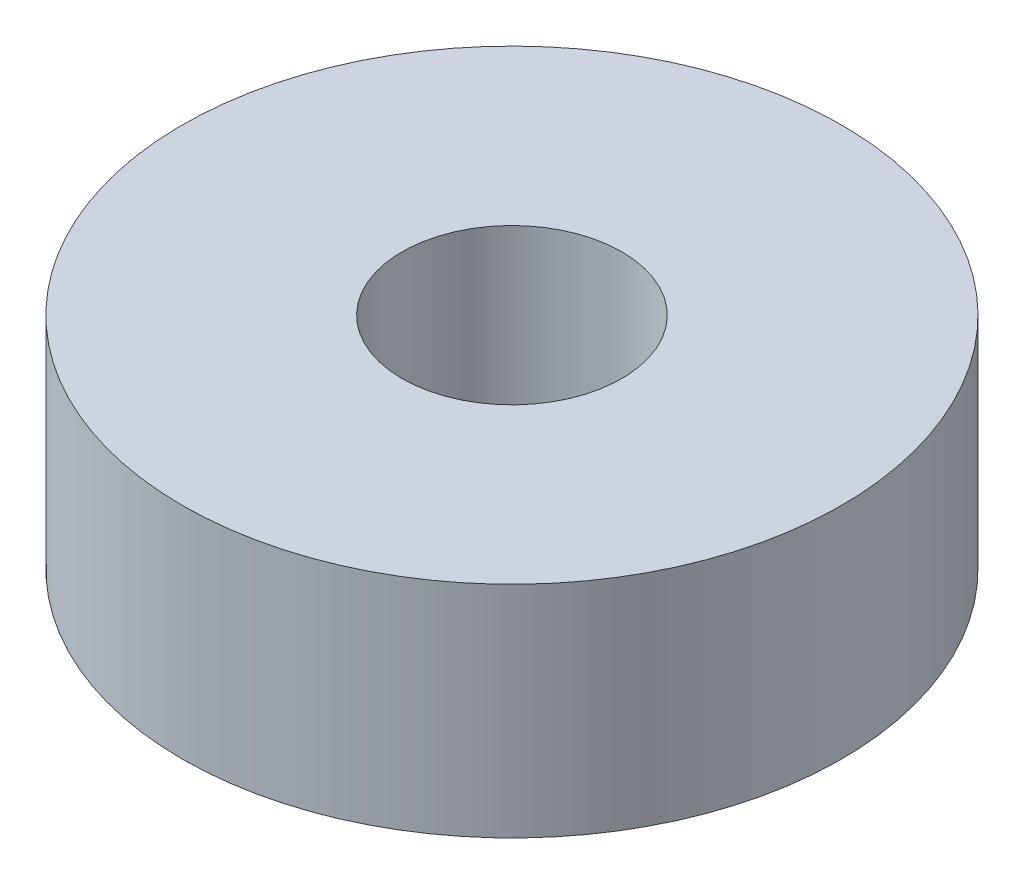
ISO-10303-21;
HEADER;
FILE_DESCRIPTION(('STEP AP214'),'2;1');
FILE_NAME('part.step','',(''),(''),'','','');
FILE_SCHEMA(('AUTOMOTIVE_DESIGN { 1 0 10303 214 1 1 1 1 }'));
ENDSEC;
DATA;
#1=APPLICATION_CONTEXT('core data for automotive mechanical design processes');
#2=APPLICATION_PROTOCOL_DEFINITION('international standard','automotive_design',2000,#1);
#3=PRODUCT_CONTEXT('',#1,'mechanical');
#4=PRODUCT('Part','Part','',(#3));
#5=PRODUCT_RELATED_PRODUCT_CATEGORY('part','',(#4));
#6=PRODUCT_DEFINITION_FORMATION('','',#4);
#7=PRODUCT_DEFINITION_CONTEXT('part definition',#1,'design');
#8=PRODUCT_DEFINITION('design','',#6,#7);
#9=PRODUCT_DEFINITION_SHAPE('','',#8);
#10=(LENGTH_UNIT() NAMED_UNIT(*) SI_UNIT(.MILLI.,.METRE.));
#11=(NAMED_UNIT(*) PLANE_ANGLE_UNIT() SI_UNIT($,.RADIAN.));
#12=(NAMED_UNIT(*) SI_UNIT($,.STERADIAN.) SOLID_ANGLE_UNIT());
#13=UNCERTAINTY_MEASURE_WITH_UNIT(LENGTH_MEASURE(1.E-05),#10,'distance_accuracy_value','');
#14=(GEOMETRIC_REPRESENTATION_CONTEXT(3) GLOBAL_UNCERTAINTY_ASSIGNED_CONTEXT((#13)) GLOBAL_UNIT_ASSIGNED_CONTEXT((#10,
#11,#12)) REPRESENTATION_CONTEXT('',''));
#15=CARTESIAN_POINT('',(0.,0.,0.));
#16=DIRECTION('',(0.,0.,1.));
#17=DIRECTION('',(1.,0.,0.));
#18=AXIS2_PLACEMENT_3D('',#15,#16,#17);
#19=CARTESIAN_POINT('',(0.,4.,0.));
#20=DIRECTION('',(0.,1.,0.));
#21=DIRECTION('',(0.,0.,1.));
#22=AXIS2_PLACEMENT_3D('',#19,#20,#21);
#23=PLANE('',#22);
#24=CARTESIAN_POINT('',(0.,4.,0.));
#25=DIRECTION('',(0.,1.,0.));
#26=DIRECTION('',(0.,0.,1.));
#27=AXIS2_PLACEMENT_3D('',#24,#25,#26);
#28=CIRCLE('',#27,6.);
#29=CARTESIAN_POINT('',(0.,4.,6.));
#30=VERTEX_POINT('',#29);
#31=EDGE_CURVE('E10',#30,#30,#28,.T.);
#32=ORIENTED_EDGE('',*,*,#31,.T.);
#33=EDGE_LOOP('',(#32));
#34=FACE_BOUND('',#33,.T.);
#35=CARTESIAN_POINT('',(0.,4.,0.));
#36=DIRECTION('',(0.,1.,0.));
#37=DIRECTION('',(0.,0.,1.));
#38=AXIS2_PLACEMENT_3D('',#35,#36,#37);
#39=CIRCLE('',#38,2.);
#40=CARTESIAN_POINT('',(0.,4.,2.));
#41=VERTEX_POINT('',#40);
#42=EDGE_CURVE('E47',#41,#41,#39,.T.);
#43=ORIENTED_EDGE('',*,*,#42,.F.);
#44=EDGE_LOOP('',(#43));
#45=FACE_BOUND('',#44,.T.);
#46=ADVANCED_FACE('F36',(#34,#45),#23,.T.);
#47=CARTESIAN_POINT('',(0.,0.,0.));
#48=DIRECTION('',(0.,1.,0.));
#49=DIRECTION('',(0.,0.,1.));
#50=AXIS2_PLACEMENT_3D('',#47,#48,#49);
#51=PLANE('',#50);
#52=CARTESIAN_POINT('',(0.,0.,0.));
#53=DIRECTION('',(0.,1.,0.));
#54=DIRECTION('',(0.,0.,1.));
#55=AXIS2_PLACEMENT_3D('',#52,#53,#54);
#56=CIRCLE('',#55,6.);
#57=CARTESIAN_POINT('',(0.,0.,6.));
#58=VERTEX_POINT('',#57);
#59=EDGE_CURVE('E40',#58,#58,#56,.T.);
#60=ORIENTED_EDGE('',*,*,#59,.F.);
#61=EDGE_LOOP('',(#60));
#62=FACE_BOUND('',#61,.T.);
#63=CARTESIAN_POINT('',(0.,0.,0.));
#64=DIRECTION('',(0.,1.,0.));
#65=DIRECTION('',(0.,0.,1.));
#66=AXIS2_PLACEMENT_3D('',#63,#64,#65);
#67=CIRCLE('',#66,2.);
#68=CARTESIAN_POINT('',(0.,0.,2.));
#69=VERTEX_POINT('',#68);
#70=EDGE_CURVE('E49',#69,#69,#67,.T.);
#71=ORIENTED_EDGE('',*,*,#70,.T.);
#72=EDGE_LOOP('',(#71));
#73=FACE_BOUND('',#72,.T.);
#74=ADVANCED_FACE('F59',(#62,#73),#51,.F.);
#75=CARTESIAN_POINT('',(0.,4.,0.));
#76=DIRECTION('',(0.,-1.,0.));
#77=DIRECTION('',(0.,0.,-1.));
#78=AXIS2_PLACEMENT_3D('',#75,#76,#77);
#79=CYLINDRICAL_SURFACE('',#78,6.);
#80=ORIENTED_EDGE('',*,*,#31,.F.);
#81=EDGE_LOOP('',(#80));
#82=FACE_BOUND('',#81,.T.);
#83=ORIENTED_EDGE('',*,*,#59,.T.);
#84=EDGE_LOOP('',(#83));
#85=FACE_BOUND('',#84,.T.);
#86=ADVANCED_FACE('F38',(#82,#85),#79,.T.);
#87=CARTESIAN_POINT('',(0.,4.,0.));
#88=DIRECTION('',(0.,-1.,0.));
#89=DIRECTION('',(0.,0.,-1.));
#90=AXIS2_PLACEMENT_3D('',#87,#88,#89);
#91=CYLINDRICAL_SURFACE('',#90,2.);
#92=ORIENTED_EDGE('',*,*,#42,.T.);
#93=EDGE_LOOP('',(#92));
#94=FACE_BOUND('',#93,.T.);
#95=ORIENTED_EDGE('',*,*,#70,.F.);
#96=EDGE_LOOP('',(#95));
#97=FACE_BOUND('',#96,.T.);
#98=ADVANCED_FACE('F55',(#94,#97),#91,.F.);
#99=CLOSED_SHELL('',(#46,#74,#86,#98));
#100=MANIFOLD_SOLID_BREP('B2',#99);
#101=ADVANCED_BREP_SHAPE_REPRESENTATION('',(#18,#100),#14);
#102=SHAPE_DEFINITION_REPRESENTATION(#9,#101);
ENDSEC;
END-ISO-10303-21;
